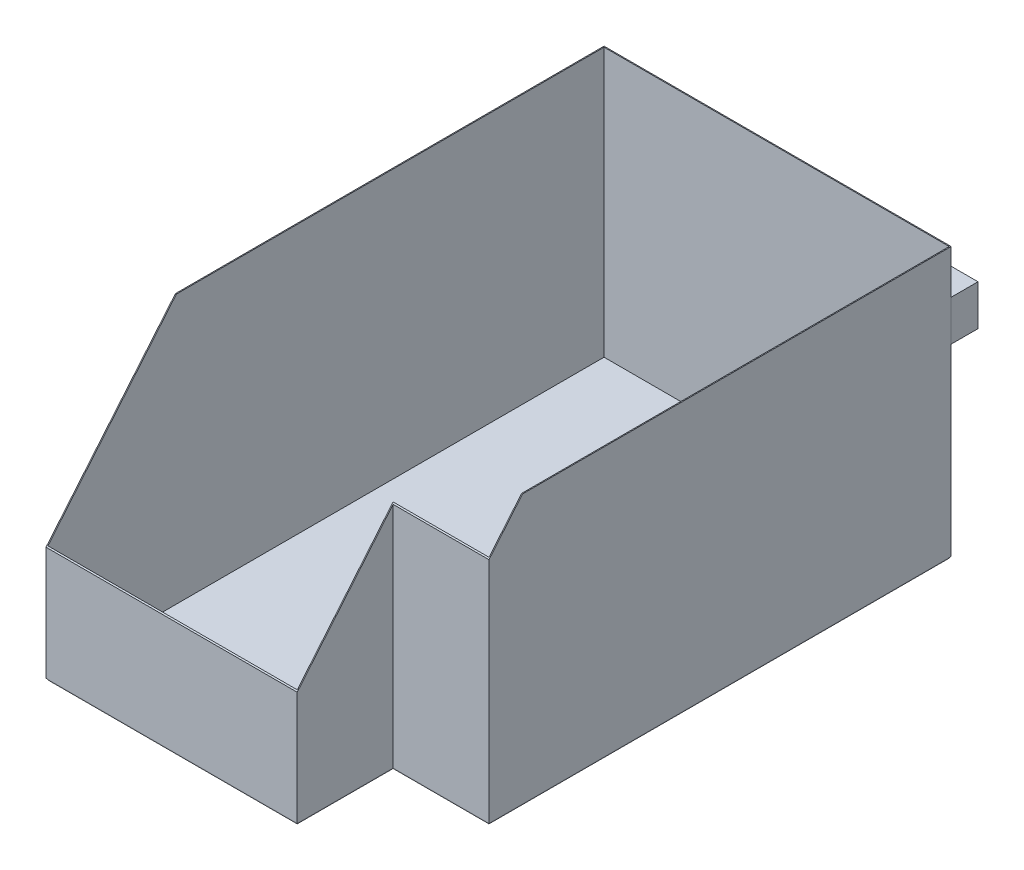
ISO-10303-21;
HEADER;
FILE_DESCRIPTION(('STEP AP214'),'2;1');
FILE_NAME('part.step','',(''),(''),'','','');
FILE_SCHEMA(('AUTOMOTIVE_DESIGN { 1 0 10303 214 1 1 1 1 }'));
ENDSEC;
DATA;
#1=APPLICATION_CONTEXT('core data for automotive mechanical design processes');
#2=APPLICATION_PROTOCOL_DEFINITION('international standard','automotive_design',2000,#1);
#3=PRODUCT_CONTEXT('',#1,'mechanical');
#4=PRODUCT('Part','Part','',(#3));
#5=PRODUCT_RELATED_PRODUCT_CATEGORY('part','',(#4));
#6=PRODUCT_DEFINITION_FORMATION('','',#4);
#7=PRODUCT_DEFINITION_CONTEXT('part definition',#1,'design');
#8=PRODUCT_DEFINITION('design','',#6,#7);
#9=PRODUCT_DEFINITION_SHAPE('','',#8);
#10=(LENGTH_UNIT() NAMED_UNIT(*) SI_UNIT(.MILLI.,.METRE.));
#11=(NAMED_UNIT(*) PLANE_ANGLE_UNIT() SI_UNIT($,.RADIAN.));
#12=(NAMED_UNIT(*) SI_UNIT($,.STERADIAN.) SOLID_ANGLE_UNIT());
#13=UNCERTAINTY_MEASURE_WITH_UNIT(LENGTH_MEASURE(1.E-05),#10,'distance_accuracy_value','');
#14=(GEOMETRIC_REPRESENTATION_CONTEXT(3) GLOBAL_UNCERTAINTY_ASSIGNED_CONTEXT((#13)) GLOBAL_UNIT_ASSIGNED_CONTEXT((#10,
#11,#12)) REPRESENTATION_CONTEXT('',''));
#15=CARTESIAN_POINT('',(0.,0.,0.));
#16=DIRECTION('',(0.,0.,1.));
#17=DIRECTION('',(1.,0.,0.));
#18=AXIS2_PLACEMENT_3D('',#15,#16,#17);
#19=CARTESIAN_POINT('',(277.848616765358,234.676087490139,-247.826300095906));
#20=DIRECTION('',(-1.,0.,0.));
#21=DIRECTION('',(0.,-1.,0.));
#22=AXIS2_PLACEMENT_3D('',#19,#20,#21);
#23=PLANE('',#22);
#24=DIRECTION('',(0.,-1.,0.));
#25=VECTOR('',#24,1.);
#26=CARTESIAN_POINT('',(277.848616765358,234.676087490139,-217.826300095906));
#27=LINE('',#26,#25);
#28=CARTESIAN_POINT('',(277.848616765358,234.676087490139,-217.826300095906));
#29=VERTEX_POINT('',#28);
#30=CARTESIAN_POINT('',(277.848616765358,192.290545925534,-217.826300095906));
#31=VERTEX_POINT('',#30);
#32=EDGE_CURVE('E113',#29,#31,#27,.T.);
#33=ORIENTED_EDGE('',*,*,#32,.T.);
#34=DIRECTION('',(0.,0.,1.));
#35=VECTOR('',#34,1.);
#36=CARTESIAN_POINT('',(277.848616765358,192.290545925534,-247.826300095906));
#37=LINE('',#36,#35);
#38=CARTESIAN_POINT('',(277.848616765358,192.290545925534,-247.826300095906));
#39=VERTEX_POINT('',#38);
#40=EDGE_CURVE('E12',#39,#31,#37,.T.);
#41=ORIENTED_EDGE('',*,*,#40,.F.);
#42=DIRECTION('',(0.,-1.,0.));
#43=VECTOR('',#42,1.);
#44=CARTESIAN_POINT('',(277.848616765358,234.676087490139,-247.826300095906));
#45=LINE('',#44,#43);
#46=CARTESIAN_POINT('',(277.848616765358,234.676087490139,-247.826300095906));
#47=VERTEX_POINT('',#46);
#48=EDGE_CURVE('E101',#47,#39,#45,.T.);
#49=ORIENTED_EDGE('',*,*,#48,.F.);
#50=DIRECTION('',(0.,0.,1.));
#51=VECTOR('',#50,1.);
#52=CARTESIAN_POINT('',(277.848616765358,234.676087490139,-247.826300095906));
#53=LINE('',#52,#51);
#54=EDGE_CURVE('E109',#47,#29,#53,.T.);
#55=ORIENTED_EDGE('',*,*,#54,.T.);
#56=EDGE_LOOP('',(#33,#41,#49,#55));
#57=FACE_BOUND('',#56,.T.);
#58=ADVANCED_FACE('F50',(#57),#23,.F.);
#59=CARTESIAN_POINT('',(277.848616765358,192.290545925534,-247.826300095906));
#60=DIRECTION('',(0.,1.,0.));
#61=DIRECTION('',(0.,0.,1.));
#62=AXIS2_PLACEMENT_3D('',#59,#60,#61);
#63=PLANE('',#62);
#64=DIRECTION('',(-1.,0.,0.));
#65=VECTOR('',#64,1.);
#66=CARTESIAN_POINT('',(277.848616765358,192.290545925534,-217.826300095906));
#67=LINE('',#66,#65);
#68=CARTESIAN_POINT('',(-82.1513832346425,192.290545925534,-217.826300095906));
#69=VERTEX_POINT('',#68);
#70=EDGE_CURVE('E105',#31,#69,#67,.T.);
#71=ORIENTED_EDGE('',*,*,#70,.T.);
#72=DIRECTION('',(0.,0.,1.));
#73=VECTOR('',#72,1.);
#74=CARTESIAN_POINT('',(-82.1513832346425,192.290545925534,-247.826300095906));
#75=LINE('',#74,#73);
#76=CARTESIAN_POINT('',(-82.1513832346425,192.290545925534,-247.826300095906));
#77=VERTEX_POINT('',#76);
#78=EDGE_CURVE('E58',#77,#69,#75,.T.);
#79=ORIENTED_EDGE('',*,*,#78,.F.);
#80=DIRECTION('',(-1.,0.,0.));
#81=VECTOR('',#80,1.);
#82=CARTESIAN_POINT('',(277.848616765358,192.290545925534,-247.826300095906));
#83=LINE('',#82,#81);
#84=EDGE_CURVE('E96',#39,#77,#83,.T.);
#85=ORIENTED_EDGE('',*,*,#84,.F.);
#86=ORIENTED_EDGE('',*,*,#40,.T.);
#87=EDGE_LOOP('',(#71,#79,#85,#86));
#88=FACE_BOUND('',#87,.T.);
#89=ADVANCED_FACE('F104',(#88),#63,.F.);
#90=CARTESIAN_POINT('',(-82.1513832346424,234.676087490139,-247.826300095906));
#91=DIRECTION('',(1.,0.,0.));
#92=DIRECTION('',(0.,1.,0.));
#93=AXIS2_PLACEMENT_3D('',#90,#91,#92);
#94=PLANE('',#93);
#95=DIRECTION('',(0.,1.,0.));
#96=VECTOR('',#95,1.);
#97=CARTESIAN_POINT('',(-82.1513832346424,234.676087490139,-217.826300095906));
#98=LINE('',#97,#96);
#99=CARTESIAN_POINT('',(-82.1513832346424,234.676087490139,-217.826300095906));
#100=VERTEX_POINT('',#99);
#101=EDGE_CURVE('E83',#69,#100,#98,.T.);
#102=ORIENTED_EDGE('',*,*,#101,.T.);
#103=DIRECTION('',(0.,0.,1.));
#104=VECTOR('',#103,1.);
#105=CARTESIAN_POINT('',(-82.1513832346424,234.676087490139,-247.826300095906));
#106=LINE('',#105,#104);
#107=CARTESIAN_POINT('',(-82.1513832346424,234.676087490139,-247.826300095906));
#108=VERTEX_POINT('',#107);
#109=EDGE_CURVE('E106',#108,#100,#106,.T.);
#110=ORIENTED_EDGE('',*,*,#109,.F.);
#111=DIRECTION('',(0.,1.,0.));
#112=VECTOR('',#111,1.);
#113=CARTESIAN_POINT('',(-82.1513832346424,234.676087490139,-247.826300095906));
#114=LINE('',#113,#112);
#115=EDGE_CURVE('E99',#77,#108,#114,.T.);
#116=ORIENTED_EDGE('',*,*,#115,.F.);
#117=ORIENTED_EDGE('',*,*,#78,.T.);
#118=EDGE_LOOP('',(#102,#110,#116,#117));
#119=FACE_BOUND('',#118,.T.);
#120=ADVANCED_FACE('F107',(#119),#94,.F.);
#121=CARTESIAN_POINT('',(277.848616765358,234.676087490139,-247.826300095906));
#122=DIRECTION('',(0.,-1.,0.));
#123=DIRECTION('',(0.,0.,-1.));
#124=AXIS2_PLACEMENT_3D('',#121,#122,#123);
#125=PLANE('',#124);
#126=DIRECTION('',(1.,0.,0.));
#127=VECTOR('',#126,1.);
#128=CARTESIAN_POINT('',(277.848616765358,234.676087490139,-217.826300095906));
#129=LINE('',#128,#127);
#130=EDGE_CURVE('E89',#100,#29,#129,.T.);
#131=ORIENTED_EDGE('',*,*,#130,.T.);
#132=ORIENTED_EDGE('',*,*,#54,.F.);
#133=DIRECTION('',(1.,0.,0.));
#134=VECTOR('',#133,1.);
#135=CARTESIAN_POINT('',(277.848616765358,234.676087490139,-247.826300095906));
#136=LINE('',#135,#134);
#137=EDGE_CURVE('E66',#108,#47,#136,.T.);
#138=ORIENTED_EDGE('',*,*,#137,.F.);
#139=ORIENTED_EDGE('',*,*,#109,.T.);
#140=EDGE_LOOP('',(#131,#132,#138,#139));
#141=FACE_BOUND('',#140,.T.);
#142=ADVANCED_FACE('F120',(#141),#125,.F.);
#143=CARTESIAN_POINT('',(0.,0.,-247.826300095906));
#144=DIRECTION('',(0.,0.,-1.));
#145=DIRECTION('',(-1.,0.,0.));
#146=AXIS2_PLACEMENT_3D('',#143,#144,#145);
#147=PLANE('',#146);
#148=ORIENTED_EDGE('',*,*,#48,.T.);
#149=ORIENTED_EDGE('',*,*,#84,.T.);
#150=ORIENTED_EDGE('',*,*,#115,.T.);
#151=ORIENTED_EDGE('',*,*,#137,.T.);
#152=EDGE_LOOP('',(#148,#149,#150,#151));
#153=FACE_BOUND('',#152,.T.);
#154=ADVANCED_FACE('F97',(#153),#147,.T.);
#155=CARTESIAN_POINT('',(0.,0.,-217.826300095906));
#156=DIRECTION('',(0.,0.,-1.));
#157=DIRECTION('',(-1.,0.,0.));
#158=AXIS2_PLACEMENT_3D('',#155,#156,#157);
#159=PLANE('',#158);
#160=ORIENTED_EDGE('',*,*,#32,.F.);
#161=ORIENTED_EDGE('',*,*,#130,.F.);
#162=ORIENTED_EDGE('',*,*,#101,.F.);
#163=ORIENTED_EDGE('',*,*,#70,.F.);
#164=EDGE_LOOP('',(#160,#161,#162,#163));
#165=FACE_BOUND('',#164,.T.);
#166=ADVANCED_FACE('F123',(#165),#159,.F.);
#167=CLOSED_SHELL('',(#58,#89,#120,#142,#154,#166));
#168=MANIFOLD_SOLID_BREP('B2',#167);
#169=CARTESIAN_POINT('',(0.,281.5,0.));
#170=DIRECTION('',(0.,1.,0.));
#171=DIRECTION('',(0.,0.,1.));
#172=AXIS2_PLACEMENT_3D('',#169,#170,#171);
#173=PLANE('',#172);
#174=DIRECTION('',(-1.,0.,0.));
#175=VECTOR('',#174,1.);
#176=CARTESIAN_POINT('',(278.848616765358,281.5,228.19522270556));
#177=LINE('',#176,#175);
#178=CARTESIAN_POINT('',(278.848616765358,281.5,228.19522270556));
#179=VERTEX_POINT('',#178);
#180=CARTESIAN_POINT('',(277.848616765358,281.5,228.19522270556));
#181=VERTEX_POINT('',#180);
#182=EDGE_CURVE('E198',#179,#181,#177,.T.);
#183=ORIENTED_EDGE('',*,*,#182,.F.);
#184=DIRECTION('',(0.,0.,-1.));
#185=VECTOR('',#184,1.);
#186=CARTESIAN_POINT('',(278.848616765358,281.5,263.173699904094));
#187=LINE('',#186,#185);
#188=CARTESIAN_POINT('',(278.848616765358,281.5,-218.826300095906));
#189=VERTEX_POINT('',#188);
#190=EDGE_CURVE('E310',#179,#189,#187,.T.);
#191=ORIENTED_EDGE('',*,*,#190,.T.);
#192=DIRECTION('',(-1.,0.,0.));
#193=VECTOR('',#192,1.);
#194=CARTESIAN_POINT('',(278.848616765358,281.5,-218.826300095906));
#195=LINE('',#194,#193);
#196=CARTESIAN_POINT('',(-83.1513832346424,281.5,-218.826300095906));
#197=VERTEX_POINT('',#196);
#198=EDGE_CURVE('E307',#189,#197,#195,.T.);
#199=ORIENTED_EDGE('',*,*,#198,.T.);
#200=DIRECTION('',(0.,0.,1.));
#201=VECTOR('',#200,1.);
#202=CARTESIAN_POINT('',(-83.1513832346424,281.5,-218.826300095906));
#203=LINE('',#202,#201);
#204=CARTESIAN_POINT('',(-83.1513832346425,281.5,228.19522270556));
#205=VERTEX_POINT('',#204);
#206=EDGE_CURVE('E302',#197,#205,#203,.T.);
#207=ORIENTED_EDGE('',*,*,#206,.T.);
#208=CARTESIAN_POINT('',(-82.1513832346424,281.5,228.19522270556));
#209=VERTEX_POINT('',#208);
#210=EDGE_CURVE('E284',#209,#205,#177,.T.);
#211=ORIENTED_EDGE('',*,*,#210,.F.);
#212=DIRECTION('',(0.,0.,1.));
#213=VECTOR('',#212,1.);
#214=CARTESIAN_POINT('',(-82.1513832346424,281.5,-217.826300095906));
#215=LINE('',#214,#213);
#216=CARTESIAN_POINT('',(-82.1513832346424,281.5,-217.826300095906));
#217=VERTEX_POINT('',#216);
#218=EDGE_CURVE('E399',#217,#209,#215,.T.);
#219=ORIENTED_EDGE('',*,*,#218,.F.);
#220=DIRECTION('',(-1.,0.,0.));
#221=VECTOR('',#220,1.);
#222=CARTESIAN_POINT('',(277.848616765358,281.5,-217.826300095906));
#223=LINE('',#222,#221);
#224=CARTESIAN_POINT('',(277.848616765358,281.5,-217.826300095906));
#225=VERTEX_POINT('',#224);
#226=EDGE_CURVE('E396',#225,#217,#223,.T.);
#227=ORIENTED_EDGE('',*,*,#226,.F.);
#228=DIRECTION('',(0.,0.,-1.));
#229=VECTOR('',#228,1.);
#230=CARTESIAN_POINT('',(277.848616765358,281.5,262.173699904094));
#231=LINE('',#230,#229);
#232=EDGE_CURVE('E403',#181,#225,#231,.T.);
#233=ORIENTED_EDGE('',*,*,#232,.F.);
#234=EDGE_LOOP('',(#183,#191,#199,#207,#211,#219,#227,#233));
#235=FACE_BOUND('',#234,.T.);
#236=ADVANCED_FACE('F183',(#235),#173,.T.);
#237=CARTESIAN_POINT('',(0.,1.5,0.));
#238=DIRECTION('',(0.,1.,0.));
#239=DIRECTION('',(0.,0.,1.));
#240=AXIS2_PLACEMENT_3D('',#237,#238,#239);
#241=PLANE('',#240);
#242=DIRECTION('',(0.,0.,1.));
#243=VECTOR('',#242,1.);
#244=CARTESIAN_POINT('',(-83.1513832346424,1.5,-218.826300095906));
#245=LINE('',#244,#243);
#246=CARTESIAN_POINT('',(-83.1513832346424,1.5,-218.826300095906));
#247=VERTEX_POINT('',#246);
#248=CARTESIAN_POINT('',(-83.1513832346424,1.5,363.173699904094));
#249=VERTEX_POINT('',#248);
#250=EDGE_CURVE('E325',#247,#249,#245,.T.);
#251=ORIENTED_EDGE('',*,*,#250,.F.);
#252=DIRECTION('',(-1.,0.,0.));
#253=VECTOR('',#252,1.);
#254=CARTESIAN_POINT('',(278.848616765358,1.5,-218.826300095906));
#255=LINE('',#254,#253);
#256=CARTESIAN_POINT('',(278.848616765358,1.5,-218.826300095906));
#257=VERTEX_POINT('',#256);
#258=EDGE_CURVE('E311',#257,#247,#255,.T.);
#259=ORIENTED_EDGE('',*,*,#258,.F.);
#260=DIRECTION('',(0.,0.,-1.));
#261=VECTOR('',#260,1.);
#262=CARTESIAN_POINT('',(278.848616765358,1.5,263.173699904094));
#263=LINE('',#262,#261);
#264=CARTESIAN_POINT('',(278.848616765358,1.5,263.173699904094));
#265=VERTEX_POINT('',#264);
#266=EDGE_CURVE('E316',#265,#257,#263,.T.);
#267=ORIENTED_EDGE('',*,*,#266,.F.);
#268=DIRECTION('',(1.,0.,0.));
#269=VECTOR('',#268,1.);
#270=CARTESIAN_POINT('',(178.848616765358,1.5,263.173699904094));
#271=LINE('',#270,#269);
#272=CARTESIAN_POINT('',(178.848616765358,1.5,263.173699904094));
#273=VERTEX_POINT('',#272);
#274=EDGE_CURVE('E336',#273,#265,#271,.T.);
#275=ORIENTED_EDGE('',*,*,#274,.F.);
#276=DIRECTION('',(0.,0.,-1.));
#277=VECTOR('',#276,1.);
#278=CARTESIAN_POINT('',(178.848616765358,1.5,363.173699904094));
#279=LINE('',#278,#277);
#280=CARTESIAN_POINT('',(178.848616765358,1.5,363.173699904094));
#281=VERTEX_POINT('',#280);
#282=EDGE_CURVE('E332',#281,#273,#279,.T.);
#283=ORIENTED_EDGE('',*,*,#282,.F.);
#284=DIRECTION('',(1.,0.,0.));
#285=VECTOR('',#284,1.);
#286=CARTESIAN_POINT('',(-83.1513832346424,1.5,363.173699904094));
#287=LINE('',#286,#285);
#288=EDGE_CURVE('E328',#249,#281,#287,.T.);
#289=ORIENTED_EDGE('',*,*,#288,.F.);
#290=EDGE_LOOP('',(#251,#259,#267,#275,#283,#289));
#291=FACE_BOUND('',#290,.T.);
#292=DIRECTION('',(-1.,0.,0.));
#293=VECTOR('',#292,1.);
#294=CARTESIAN_POINT('',(277.848616765358,1.5,-217.826300095906));
#295=LINE('',#294,#293);
#296=CARTESIAN_POINT('',(277.848616765358,1.5,-217.826300095906));
#297=VERTEX_POINT('',#296);
#298=CARTESIAN_POINT('',(-82.1513832346424,1.5,-217.826300095906));
#299=VERTEX_POINT('',#298);
#300=EDGE_CURVE('E206',#297,#299,#295,.T.);
#301=ORIENTED_EDGE('',*,*,#300,.T.);
#302=DIRECTION('',(0.,0.,1.));
#303=VECTOR('',#302,1.);
#304=CARTESIAN_POINT('',(-82.1513832346424,1.5,-217.826300095906));
#305=LINE('',#304,#303);
#306=CARTESIAN_POINT('',(-82.1513832346424,1.5,362.173699904094));
#307=VERTEX_POINT('',#306);
#308=EDGE_CURVE('E391',#299,#307,#305,.T.);
#309=ORIENTED_EDGE('',*,*,#308,.T.);
#310=DIRECTION('',(1.,0.,0.));
#311=VECTOR('',#310,1.);
#312=CARTESIAN_POINT('',(-82.1513832346424,1.5,362.173699904094));
#313=LINE('',#312,#311);
#314=CARTESIAN_POINT('',(177.848616765358,1.5,362.173699904094));
#315=VERTEX_POINT('',#314);
#316=EDGE_CURVE('E410',#307,#315,#313,.T.);
#317=ORIENTED_EDGE('',*,*,#316,.T.);
#318=DIRECTION('',(0.,0.,-1.));
#319=VECTOR('',#318,1.);
#320=CARTESIAN_POINT('',(177.848616765358,1.5,362.173699904094));
#321=LINE('',#320,#319);
#322=CARTESIAN_POINT('',(177.848616765358,1.5,262.173699904094));
#323=VERTEX_POINT('',#322);
#324=EDGE_CURVE('E414',#315,#323,#321,.T.);
#325=ORIENTED_EDGE('',*,*,#324,.T.);
#326=DIRECTION('',(1.,0.,0.));
#327=VECTOR('',#326,1.);
#328=CARTESIAN_POINT('',(177.848616765358,1.5,262.173699904094));
#329=LINE('',#328,#327);
#330=CARTESIAN_POINT('',(277.848616765358,1.5,262.173699904094));
#331=VERTEX_POINT('',#330);
#332=EDGE_CURVE('E418',#323,#331,#329,.T.);
#333=ORIENTED_EDGE('',*,*,#332,.T.);
#334=DIRECTION('',(0.,0.,-1.));
#335=VECTOR('',#334,1.);
#336=CARTESIAN_POINT('',(277.848616765358,1.5,262.173699904094));
#337=LINE('',#336,#335);
#338=EDGE_CURVE('E400',#331,#297,#337,.T.);
#339=ORIENTED_EDGE('',*,*,#338,.T.);
#340=EDGE_LOOP('',(#301,#309,#317,#325,#333,#339));
#341=FACE_BOUND('',#340,.T.);
#342=ADVANCED_FACE('F365',(#291,#341),#241,.F.);
#343=CARTESIAN_POINT('',(-83.1513832346424,281.5,-218.826300095906));
#344=DIRECTION('',(1.,0.,0.));
#345=DIRECTION('',(0.,0.,-1.));
#346=AXIS2_PLACEMENT_3D('',#343,#344,#345);
#347=PLANE('',#346);
#348=DIRECTION('',(0.,-1.,0.));
#349=VECTOR('',#348,1.);
#350=CARTESIAN_POINT('',(-83.1513832346424,281.5,363.173699904094));
#351=LINE('',#350,#349);
#352=CARTESIAN_POINT('',(-83.1513832346425,119.920481981417,363.173699904094));
#353=VERTEX_POINT('',#352);
#354=EDGE_CURVE('E192',#353,#249,#351,.T.);
#355=ORIENTED_EDGE('',*,*,#354,.F.);
#356=DIRECTION('',(0.,-0.76745249417068,0.641105817467914));
#357=VECTOR('',#356,1.);
#358=CARTESIAN_POINT('',(-83.1513832346425,119.920481981417,363.173699904094));
#359=LINE('',#358,#357);
#360=EDGE_CURVE('E287',#205,#353,#359,.T.);
#361=ORIENTED_EDGE('',*,*,#360,.F.);
#362=ORIENTED_EDGE('',*,*,#206,.F.);
#363=DIRECTION('',(0.,-1.,0.));
#364=VECTOR('',#363,1.);
#365=CARTESIAN_POINT('',(-83.1513832346424,281.5,-218.826300095906));
#366=LINE('',#365,#364);
#367=EDGE_CURVE('E324',#197,#247,#366,.T.);
#368=ORIENTED_EDGE('',*,*,#367,.T.);
#369=ORIENTED_EDGE('',*,*,#250,.T.);
#370=EDGE_LOOP('',(#355,#361,#362,#368,#369));
#371=FACE_BOUND('',#370,.T.);
#372=ADVANCED_FACE('F185',(#371),#347,.F.);
#373=CARTESIAN_POINT('',(-83.1513832346424,281.5,363.173699904094));
#374=DIRECTION('',(0.,0.,-1.));
#375=DIRECTION('',(-1.,0.,0.));
#376=AXIS2_PLACEMENT_3D('',#373,#374,#375);
#377=PLANE('',#376);
#378=DIRECTION('',(0.,-1.,0.));
#379=VECTOR('',#378,1.);
#380=CARTESIAN_POINT('',(178.848616765358,281.5,363.173699904094));
#381=LINE('',#380,#379);
#382=CARTESIAN_POINT('',(178.848616765358,119.920481981417,363.173699904094));
#383=VERTEX_POINT('',#382);
#384=EDGE_CURVE('E354',#383,#281,#381,.T.);
#385=ORIENTED_EDGE('',*,*,#384,.F.);
#386=DIRECTION('',(-1.,0.,0.));
#387=VECTOR('',#386,1.);
#388=CARTESIAN_POINT('',(278.848616765358,119.920481981417,363.173699904094));
#389=LINE('',#388,#387);
#390=EDGE_CURVE('E362',#383,#353,#389,.T.);
#391=ORIENTED_EDGE('',*,*,#390,.T.);
#392=ORIENTED_EDGE('',*,*,#354,.T.);
#393=ORIENTED_EDGE('',*,*,#288,.T.);
#394=EDGE_LOOP('',(#385,#391,#392,#393));
#395=FACE_BOUND('',#394,.T.);
#396=ADVANCED_FACE('F360',(#395),#377,.F.);
#397=CARTESIAN_POINT('',(178.848616765358,281.5,363.173699904094));
#398=DIRECTION('',(-1.,0.,0.));
#399=DIRECTION('',(0.,0.,1.));
#400=AXIS2_PLACEMENT_3D('',#397,#398,#399);
#401=PLANE('',#400);
#402=DIRECTION('',(0.,-1.,0.));
#403=VECTOR('',#402,1.);
#404=CARTESIAN_POINT('',(178.848616765358,281.5,263.173699904094));
#405=LINE('',#404,#403);
#406=CARTESIAN_POINT('',(178.848616765358,239.628098611973,263.173699904094));
#407=VERTEX_POINT('',#406);
#408=EDGE_CURVE('E351',#407,#273,#405,.T.);
#409=ORIENTED_EDGE('',*,*,#408,.F.);
#410=DIRECTION('',(0.,-0.76745249417068,0.641105817467914));
#411=VECTOR('',#410,1.);
#412=CARTESIAN_POINT('',(178.848616765358,215.088124694482,283.673626816202));
#413=LINE('',#412,#411);
#414=EDGE_CURVE('E386',#407,#383,#413,.T.);
#415=ORIENTED_EDGE('',*,*,#414,.T.);
#416=ORIENTED_EDGE('',*,*,#384,.T.);
#417=ORIENTED_EDGE('',*,*,#282,.T.);
#418=EDGE_LOOP('',(#409,#415,#416,#417));
#419=FACE_BOUND('',#418,.T.);
#420=ADVANCED_FACE('F385',(#419),#401,.F.);
#421=CARTESIAN_POINT('',(178.848616765358,281.5,263.173699904094));
#422=DIRECTION('',(0.,0.,-1.));
#423=DIRECTION('',(-1.,0.,0.));
#424=AXIS2_PLACEMENT_3D('',#421,#422,#423);
#425=PLANE('',#424);
#426=DIRECTION('',(0.,-1.,0.));
#427=VECTOR('',#426,1.);
#428=CARTESIAN_POINT('',(278.848616765358,281.5,263.173699904094));
#429=LINE('',#428,#427);
#430=CARTESIAN_POINT('',(278.848616765358,239.628098611973,263.173699904094));
#431=VERTEX_POINT('',#430);
#432=EDGE_CURVE('E348',#431,#265,#429,.T.);
#433=ORIENTED_EDGE('',*,*,#432,.F.);
#434=DIRECTION('',(-1.,0.,0.));
#435=VECTOR('',#434,1.);
#436=CARTESIAN_POINT('',(178.848616765358,239.628098611973,263.173699904094));
#437=LINE('',#436,#435);
#438=EDGE_CURVE('E382',#431,#407,#437,.T.);
#439=ORIENTED_EDGE('',*,*,#438,.T.);
#440=ORIENTED_EDGE('',*,*,#408,.T.);
#441=ORIENTED_EDGE('',*,*,#274,.T.);
#442=EDGE_LOOP('',(#433,#439,#440,#441));
#443=FACE_BOUND('',#442,.T.);
#444=ADVANCED_FACE('F380',(#443),#425,.F.);
#445=CARTESIAN_POINT('',(278.848616765358,281.5,263.173699904094));
#446=DIRECTION('',(-1.,0.,0.));
#447=DIRECTION('',(0.,0.,1.));
#448=AXIS2_PLACEMENT_3D('',#445,#446,#447);
#449=PLANE('',#448);
#450=ORIENTED_EDGE('',*,*,#190,.F.);
#451=DIRECTION('',(0.,-0.76745249417068,0.641105817467914));
#452=VECTOR('',#451,1.);
#453=CARTESIAN_POINT('',(278.848616765358,119.920481981417,363.173699904094));
#454=LINE('',#453,#452);
#455=EDGE_CURVE('E296',#179,#431,#454,.T.);
#456=ORIENTED_EDGE('',*,*,#455,.T.);
#457=ORIENTED_EDGE('',*,*,#432,.T.);
#458=ORIENTED_EDGE('',*,*,#266,.T.);
#459=DIRECTION('',(0.,-1.,0.));
#460=VECTOR('',#459,1.);
#461=CARTESIAN_POINT('',(278.848616765358,281.5,-218.826300095906));
#462=LINE('',#461,#460);
#463=EDGE_CURVE('E344',#189,#257,#462,.T.);
#464=ORIENTED_EDGE('',*,*,#463,.F.);
#465=EDGE_LOOP('',(#450,#456,#457,#458,#464));
#466=FACE_BOUND('',#465,.T.);
#467=ADVANCED_FACE('F375',(#466),#449,.F.);
#468=CARTESIAN_POINT('',(278.848616765358,281.5,-218.826300095906));
#469=DIRECTION('',(0.,0.,1.));
#470=DIRECTION('',(1.,0.,0.));
#471=AXIS2_PLACEMENT_3D('',#468,#469,#470);
#472=PLANE('',#471);
#473=ORIENTED_EDGE('',*,*,#258,.T.);
#474=ORIENTED_EDGE('',*,*,#367,.F.);
#475=ORIENTED_EDGE('',*,*,#198,.F.);
#476=ORIENTED_EDGE('',*,*,#463,.T.);
#477=EDGE_LOOP('',(#473,#474,#475,#476));
#478=FACE_BOUND('',#477,.T.);
#479=ADVANCED_FACE('F370',(#478),#472,.F.);
#480=CARTESIAN_POINT('',(277.848616765358,281.5,-217.826300095906));
#481=DIRECTION('',(0.,0.,1.));
#482=DIRECTION('',(1.,0.,0.));
#483=AXIS2_PLACEMENT_3D('',#480,#481,#482);
#484=PLANE('',#483);
#485=ORIENTED_EDGE('',*,*,#300,.F.);
#486=DIRECTION('',(0.,-1.,0.));
#487=VECTOR('',#486,1.);
#488=CARTESIAN_POINT('',(277.848616765358,281.5,-217.826300095906));
#489=LINE('',#488,#487);
#490=EDGE_CURVE('E405',#225,#297,#489,.T.);
#491=ORIENTED_EDGE('',*,*,#490,.F.);
#492=ORIENTED_EDGE('',*,*,#226,.T.);
#493=DIRECTION('',(0.,-1.,0.));
#494=VECTOR('',#493,1.);
#495=CARTESIAN_POINT('',(-82.1513832346424,281.5,-217.826300095906));
#496=LINE('',#495,#494);
#497=EDGE_CURVE('E319',#217,#299,#496,.T.);
#498=ORIENTED_EDGE('',*,*,#497,.T.);
#499=EDGE_LOOP('',(#485,#491,#492,#498));
#500=FACE_BOUND('',#499,.T.);
#501=ADVANCED_FACE('F442',(#500),#484,.T.);
#502=CARTESIAN_POINT('',(-82.1513832346424,281.5,-217.826300095906));
#503=DIRECTION('',(1.,0.,0.));
#504=DIRECTION('',(0.,0.,-1.));
#505=AXIS2_PLACEMENT_3D('',#502,#503,#504);
#506=PLANE('',#505);
#507=DIRECTION('',(0.,0.76745249417068,-0.641105817467914));
#508=VECTOR('',#507,1.);
#509=CARTESIAN_POINT('',(-82.1513832346424,500.950732966114,44.8729420161136));
#510=LINE('',#509,#508);
#511=CARTESIAN_POINT('',(-82.1513832346424,121.117558147723,362.173699904094));
#512=VERTEX_POINT('',#511);
#513=EDGE_CURVE('E290',#512,#209,#510,.T.);
#514=ORIENTED_EDGE('',*,*,#513,.F.);
#515=DIRECTION('',(0.,-1.,0.));
#516=VECTOR('',#515,1.);
#517=CARTESIAN_POINT('',(-82.1513832346424,281.5,362.173699904094));
#518=LINE('',#517,#516);
#519=EDGE_CURVE('E435',#512,#307,#518,.T.);
#520=ORIENTED_EDGE('',*,*,#519,.T.);
#521=ORIENTED_EDGE('',*,*,#308,.F.);
#522=ORIENTED_EDGE('',*,*,#497,.F.);
#523=ORIENTED_EDGE('',*,*,#218,.T.);
#524=EDGE_LOOP('',(#514,#520,#521,#522,#523));
#525=FACE_BOUND('',#524,.T.);
#526=ADVANCED_FACE('F450',(#525),#506,.T.);
#527=CARTESIAN_POINT('',(-82.1513832346424,281.5,362.173699904094));
#528=DIRECTION('',(0.,0.,-1.));
#529=DIRECTION('',(-1.,0.,0.));
#530=AXIS2_PLACEMENT_3D('',#527,#528,#529);
#531=PLANE('',#530);
#532=DIRECTION('',(-1.,0.,0.));
#533=VECTOR('',#532,1.);
#534=CARTESIAN_POINT('',(-82.1513832346426,121.117558147723,362.173699904094));
#535=LINE('',#534,#533);
#536=CARTESIAN_POINT('',(177.848616765358,121.117558147723,362.173699904094));
#537=VERTEX_POINT('',#536);
#538=EDGE_CURVE('E452',#537,#512,#535,.T.);
#539=ORIENTED_EDGE('',*,*,#538,.F.);
#540=DIRECTION('',(0.,-1.,0.));
#541=VECTOR('',#540,1.);
#542=CARTESIAN_POINT('',(177.848616765358,281.5,362.173699904094));
#543=LINE('',#542,#541);
#544=EDGE_CURVE('E433',#537,#315,#543,.T.);
#545=ORIENTED_EDGE('',*,*,#544,.T.);
#546=ORIENTED_EDGE('',*,*,#316,.F.);
#547=ORIENTED_EDGE('',*,*,#519,.F.);
#548=EDGE_LOOP('',(#539,#545,#546,#547));
#549=FACE_BOUND('',#548,.T.);
#550=ADVANCED_FACE('F455',(#549),#531,.T.);
#551=CARTESIAN_POINT('',(177.848616765358,281.5,362.173699904094));
#552=DIRECTION('',(-1.,0.,0.));
#553=DIRECTION('',(0.,0.,1.));
#554=AXIS2_PLACEMENT_3D('',#551,#552,#553);
#555=PLANE('',#554);
#556=DIRECTION('',(0.,-0.76745249417068,0.641105817467914));
#557=VECTOR('',#556,1.);
#558=CARTESIAN_POINT('',(177.848616765358,215.580142953125,283.262610147011));
#559=LINE('',#558,#557);
#560=CARTESIAN_POINT('',(177.848616765358,240.825174778278,262.173699904094));
#561=VERTEX_POINT('',#560);
#562=EDGE_CURVE('E462',#561,#537,#559,.T.);
#563=ORIENTED_EDGE('',*,*,#562,.F.);
#564=DIRECTION('',(0.,-1.,0.));
#565=VECTOR('',#564,1.);
#566=CARTESIAN_POINT('',(177.848616765358,281.5,262.173699904094));
#567=LINE('',#566,#565);
#568=EDGE_CURVE('E430',#561,#323,#567,.T.);
#569=ORIENTED_EDGE('',*,*,#568,.T.);
#570=ORIENTED_EDGE('',*,*,#324,.F.);
#571=ORIENTED_EDGE('',*,*,#544,.F.);
#572=EDGE_LOOP('',(#563,#569,#570,#571));
#573=FACE_BOUND('',#572,.T.);
#574=ADVANCED_FACE('F460',(#573),#555,.T.);
#575=CARTESIAN_POINT('',(177.848616765358,281.5,262.173699904094));
#576=DIRECTION('',(0.,0.,-1.));
#577=DIRECTION('',(-1.,0.,0.));
#578=AXIS2_PLACEMENT_3D('',#575,#576,#577);
#579=PLANE('',#578);
#580=DIRECTION('',(-1.,0.,0.));
#581=VECTOR('',#580,1.);
#582=CARTESIAN_POINT('',(177.848616765358,240.825174778278,262.173699904094));
#583=LINE('',#582,#581);
#584=CARTESIAN_POINT('',(277.848616765358,240.825174778279,262.173699904094));
#585=VERTEX_POINT('',#584);
#586=EDGE_CURVE('E466',#585,#561,#583,.T.);
#587=ORIENTED_EDGE('',*,*,#586,.F.);
#588=DIRECTION('',(0.,-1.,0.));
#589=VECTOR('',#588,1.);
#590=CARTESIAN_POINT('',(277.848616765358,281.5,262.173699904094));
#591=LINE('',#590,#589);
#592=EDGE_CURVE('E427',#585,#331,#591,.T.);
#593=ORIENTED_EDGE('',*,*,#592,.T.);
#594=ORIENTED_EDGE('',*,*,#332,.F.);
#595=ORIENTED_EDGE('',*,*,#568,.F.);
#596=EDGE_LOOP('',(#587,#593,#594,#595));
#597=FACE_BOUND('',#596,.T.);
#598=ADVANCED_FACE('F465',(#597),#579,.T.);
#599=CARTESIAN_POINT('',(277.848616765358,281.5,262.173699904094));
#600=DIRECTION('',(-1.,0.,0.));
#601=DIRECTION('',(0.,0.,1.));
#602=AXIS2_PLACEMENT_3D('',#599,#600,#601);
#603=PLANE('',#602);
#604=DIRECTION('',(0.,-0.76745249417068,0.641105817467914));
#605=VECTOR('',#604,1.);
#606=CARTESIAN_POINT('',(277.848616765358,264.781968817434,242.16094322789));
#607=LINE('',#606,#605);
#608=EDGE_CURVE('E48',#181,#585,#607,.T.);
#609=ORIENTED_EDGE('',*,*,#608,.F.);
#610=ORIENTED_EDGE('',*,*,#232,.T.);
#611=ORIENTED_EDGE('',*,*,#490,.T.);
#612=ORIENTED_EDGE('',*,*,#338,.F.);
#613=ORIENTED_EDGE('',*,*,#592,.F.);
#614=EDGE_LOOP('',(#609,#610,#611,#612,#613));
#615=FACE_BOUND('',#614,.T.);
#616=ADVANCED_FACE('F448',(#615),#603,.T.);
#617=CARTESIAN_POINT('',(278.848616765358,119.920481981417,363.173699904094));
#618=DIRECTION('',(0.,-0.641105817467914,-0.76745249417068));
#619=DIRECTION('',(0.,0.76745249417068,-0.641105817467914));
#620=AXIS2_PLACEMENT_3D('',#617,#618,#619);
#621=PLANE('',#620);
#622=ORIENTED_EDGE('',*,*,#438,.F.);
#623=ORIENTED_EDGE('',*,*,#455,.F.);
#624=ORIENTED_EDGE('',*,*,#182,.T.);
#625=ORIENTED_EDGE('',*,*,#608,.T.);
#626=ORIENTED_EDGE('',*,*,#586,.T.);
#627=ORIENTED_EDGE('',*,*,#562,.T.);
#628=ORIENTED_EDGE('',*,*,#538,.T.);
#629=ORIENTED_EDGE('',*,*,#513,.T.);
#630=ORIENTED_EDGE('',*,*,#210,.T.);
#631=ORIENTED_EDGE('',*,*,#360,.T.);
#632=ORIENTED_EDGE('',*,*,#390,.F.);
#633=ORIENTED_EDGE('',*,*,#414,.F.);
#634=EDGE_LOOP('',(#622,#623,#624,#625,#626,#627,#628,#629,#630,#631,#632,#633));
#635=FACE_BOUND('',#634,.T.);
#636=ADVANCED_FACE('F286',(#635),#621,.F.);
#637=CLOSED_SHELL('',(#236,#342,#372,#396,#420,#444,#467,#479,#501,#526,#550,#574,#598,#616,#636));
#638=MANIFOLD_SOLID_BREP('B6',#637);
#639=CARTESIAN_POINT('',(-82.1513832346424,1.5,-217.826300095906));
#640=DIRECTION('',(1.,0.,0.));
#641=DIRECTION('',(0.,0.,-1.));
#642=AXIS2_PLACEMENT_3D('',#639,#640,#641);
#643=PLANE('',#642);
#644=DIRECTION('',(0.,0.,1.));
#645=VECTOR('',#644,1.);
#646=CARTESIAN_POINT('',(-82.1513832346424,0.,-217.826300095906));
#647=LINE('',#646,#645);
#648=CARTESIAN_POINT('',(-82.1513832346424,0.,-217.826300095906));
#649=VERTEX_POINT('',#648);
#650=CARTESIAN_POINT('',(-82.1513832346424,0.,362.173699904094));
#651=VERTEX_POINT('',#650);
#652=EDGE_CURVE('E683',#649,#651,#647,.T.);
#653=ORIENTED_EDGE('',*,*,#652,.T.);
#654=DIRECTION('',(0.,-1.,0.));
#655=VECTOR('',#654,1.);
#656=CARTESIAN_POINT('',(-82.1513832346424,1.5,362.173699904094));
#657=LINE('',#656,#655);
#658=CARTESIAN_POINT('',(-82.1513832346424,1.5,362.173699904094));
#659=VERTEX_POINT('',#658);
#660=EDGE_CURVE('E181',#659,#651,#657,.T.);
#661=ORIENTED_EDGE('',*,*,#660,.F.);
#662=DIRECTION('',(0.,0.,1.));
#663=VECTOR('',#662,1.);
#664=CARTESIAN_POINT('',(-82.1513832346424,1.5,-217.826300095906));
#665=LINE('',#664,#663);
#666=CARTESIAN_POINT('',(-82.1513832346424,1.5,-217.826300095906));
#667=VERTEX_POINT('',#666);
#668=EDGE_CURVE('E693',#667,#659,#665,.T.);
#669=ORIENTED_EDGE('',*,*,#668,.F.);
#670=DIRECTION('',(0.,-1.,0.));
#671=VECTOR('',#670,1.);
#672=CARTESIAN_POINT('',(-82.1513832346424,1.5,-217.826300095906));
#673=LINE('',#672,#671);
#674=EDGE_CURVE('E679',#667,#649,#673,.T.);
#675=ORIENTED_EDGE('',*,*,#674,.T.);
#676=EDGE_LOOP('',(#653,#661,#669,#675));
#677=FACE_BOUND('',#676,.T.);
#678=ADVANCED_FACE('F599',(#677),#643,.F.);
#679=CARTESIAN_POINT('',(-82.1513832346424,1.5,362.173699904094));
#680=DIRECTION('',(0.,0.,-1.));
#681=DIRECTION('',(-1.,0.,0.));
#682=AXIS2_PLACEMENT_3D('',#679,#680,#681);
#683=PLANE('',#682);
#684=DIRECTION('',(1.,0.,0.));
#685=VECTOR('',#684,1.);
#686=CARTESIAN_POINT('',(-82.1513832346424,0.,362.173699904094));
#687=LINE('',#686,#685);
#688=CARTESIAN_POINT('',(177.848616765358,0.,362.173699904094));
#689=VERTEX_POINT('',#688);
#690=EDGE_CURVE('E686',#651,#689,#687,.T.);
#691=ORIENTED_EDGE('',*,*,#690,.T.);
#692=DIRECTION('',(0.,-1.,0.));
#693=VECTOR('',#692,1.);
#694=CARTESIAN_POINT('',(177.848616765358,1.5,362.173699904094));
#695=LINE('',#694,#693);
#696=CARTESIAN_POINT('',(177.848616765358,1.5,362.173699904094));
#697=VERTEX_POINT('',#696);
#698=EDGE_CURVE('E607',#697,#689,#695,.T.);
#699=ORIENTED_EDGE('',*,*,#698,.F.);
#700=DIRECTION('',(1.,0.,0.));
#701=VECTOR('',#700,1.);
#702=CARTESIAN_POINT('',(-82.1513832346424,1.5,362.173699904094));
#703=LINE('',#702,#701);
#704=EDGE_CURVE('E652',#659,#697,#703,.T.);
#705=ORIENTED_EDGE('',*,*,#704,.F.);
#706=ORIENTED_EDGE('',*,*,#660,.T.);
#707=EDGE_LOOP('',(#691,#699,#705,#706));
#708=FACE_BOUND('',#707,.T.);
#709=ADVANCED_FACE('F717',(#708),#683,.F.);
#710=CARTESIAN_POINT('',(177.848616765358,1.5,262.173699904094));
#711=DIRECTION('',(-1.,0.,0.));
#712=DIRECTION('',(0.,0.,1.));
#713=AXIS2_PLACEMENT_3D('',#710,#711,#712);
#714=PLANE('',#713);
#715=DIRECTION('',(0.,0.,-1.));
#716=VECTOR('',#715,1.);
#717=CARTESIAN_POINT('',(177.848616765358,0.,262.173699904094));
#718=LINE('',#717,#716);
#719=CARTESIAN_POINT('',(177.848616765358,0.,262.173699904094));
#720=VERTEX_POINT('',#719);
#721=EDGE_CURVE('E688',#689,#720,#718,.T.);
#722=ORIENTED_EDGE('',*,*,#721,.T.);
#723=DIRECTION('',(0.,-1.,0.));
#724=VECTOR('',#723,1.);
#725=CARTESIAN_POINT('',(177.848616765358,1.5,262.173699904094));
#726=LINE('',#725,#724);
#727=CARTESIAN_POINT('',(177.848616765358,1.5,262.173699904094));
#728=VERTEX_POINT('',#727);
#729=EDGE_CURVE('E674',#728,#720,#726,.T.);
#730=ORIENTED_EDGE('',*,*,#729,.F.);
#731=DIRECTION('',(0.,0.,-1.));
#732=VECTOR('',#731,1.);
#733=CARTESIAN_POINT('',(177.848616765358,1.5,262.173699904094));
#734=LINE('',#733,#732);
#735=EDGE_CURVE('E665',#697,#728,#734,.T.);
#736=ORIENTED_EDGE('',*,*,#735,.F.);
#737=ORIENTED_EDGE('',*,*,#698,.T.);
#738=EDGE_LOOP('',(#722,#730,#736,#737));
#739=FACE_BOUND('',#738,.T.);
#740=ADVANCED_FACE('F699',(#739),#714,.F.);
#741=CARTESIAN_POINT('',(277.848616765358,1.5,262.173699904094));
#742=DIRECTION('',(0.,0.,-1.));
#743=DIRECTION('',(-1.,0.,0.));
#744=AXIS2_PLACEMENT_3D('',#741,#742,#743);
#745=PLANE('',#744);
#746=DIRECTION('',(1.,0.,0.));
#747=VECTOR('',#746,1.);
#748=CARTESIAN_POINT('',(277.848616765358,0.,262.173699904094));
#749=LINE('',#748,#747);
#750=CARTESIAN_POINT('',(277.848616765358,0.,262.173699904094));
#751=VERTEX_POINT('',#750);
#752=EDGE_CURVE('E673',#720,#751,#749,.T.);
#753=ORIENTED_EDGE('',*,*,#752,.T.);
#754=DIRECTION('',(0.,-1.,0.));
#755=VECTOR('',#754,1.);
#756=CARTESIAN_POINT('',(277.848616765358,1.5,262.173699904094));
#757=LINE('',#756,#755);
#758=CARTESIAN_POINT('',(277.848616765358,1.5,262.173699904094));
#759=VERTEX_POINT('',#758);
#760=EDGE_CURVE('E670',#759,#751,#757,.T.);
#761=ORIENTED_EDGE('',*,*,#760,.F.);
#762=DIRECTION('',(1.,0.,0.));
#763=VECTOR('',#762,1.);
#764=CARTESIAN_POINT('',(277.848616765358,1.5,262.173699904094));
#765=LINE('',#764,#763);
#766=EDGE_CURVE('E659',#728,#759,#765,.T.);
#767=ORIENTED_EDGE('',*,*,#766,.F.);
#768=ORIENTED_EDGE('',*,*,#729,.T.);
#769=EDGE_LOOP('',(#753,#761,#767,#768));
#770=FACE_BOUND('',#769,.T.);
#771=ADVANCED_FACE('F671',(#770),#745,.F.);
#772=CARTESIAN_POINT('',(277.848616765358,1.5,-217.826300095906));
#773=DIRECTION('',(-1.,0.,0.));
#774=DIRECTION('',(0.,0.,1.));
#775=AXIS2_PLACEMENT_3D('',#772,#773,#774);
#776=PLANE('',#775);
#777=DIRECTION('',(0.,0.,-1.));
#778=VECTOR('',#777,1.);
#779=CARTESIAN_POINT('',(277.848616765358,0.,-217.826300095906));
#780=LINE('',#779,#778);
#781=CARTESIAN_POINT('',(277.848616765358,0.,-217.826300095906));
#782=VERTEX_POINT('',#781);
#783=EDGE_CURVE('E638',#751,#782,#780,.T.);
#784=ORIENTED_EDGE('',*,*,#783,.T.);
#785=DIRECTION('',(0.,-1.,0.));
#786=VECTOR('',#785,1.);
#787=CARTESIAN_POINT('',(277.848616765358,1.5,-217.826300095906));
#788=LINE('',#787,#786);
#789=CARTESIAN_POINT('',(277.848616765358,1.5,-217.826300095906));
#790=VERTEX_POINT('',#789);
#791=EDGE_CURVE('E675',#790,#782,#788,.T.);
#792=ORIENTED_EDGE('',*,*,#791,.F.);
#793=DIRECTION('',(0.,0.,-1.));
#794=VECTOR('',#793,1.);
#795=CARTESIAN_POINT('',(277.848616765358,1.5,-217.826300095906));
#796=LINE('',#795,#794);
#797=EDGE_CURVE('E663',#759,#790,#796,.T.);
#798=ORIENTED_EDGE('',*,*,#797,.F.);
#799=ORIENTED_EDGE('',*,*,#760,.T.);
#800=EDGE_LOOP('',(#784,#792,#798,#799));
#801=FACE_BOUND('',#800,.T.);
#802=ADVANCED_FACE('F677',(#801),#776,.F.);
#803=CARTESIAN_POINT('',(-82.1513832346424,1.5,-217.826300095906));
#804=DIRECTION('',(0.,0.,1.));
#805=DIRECTION('',(1.,0.,0.));
#806=AXIS2_PLACEMENT_3D('',#803,#804,#805);
#807=PLANE('',#806);
#808=DIRECTION('',(-1.,0.,0.));
#809=VECTOR('',#808,1.);
#810=CARTESIAN_POINT('',(-82.1513832346424,0.,-217.826300095906));
#811=LINE('',#810,#809);
#812=EDGE_CURVE('E644',#782,#649,#811,.T.);
#813=ORIENTED_EDGE('',*,*,#812,.T.);
#814=ORIENTED_EDGE('',*,*,#674,.F.);
#815=DIRECTION('',(-1.,0.,0.));
#816=VECTOR('',#815,1.);
#817=CARTESIAN_POINT('',(-82.1513832346424,1.5,-217.826300095906));
#818=LINE('',#817,#816);
#819=EDGE_CURVE('E615',#790,#667,#818,.T.);
#820=ORIENTED_EDGE('',*,*,#819,.F.);
#821=ORIENTED_EDGE('',*,*,#791,.T.);
#822=EDGE_LOOP('',(#813,#814,#820,#821));
#823=FACE_BOUND('',#822,.T.);
#824=ADVANCED_FACE('F706',(#823),#807,.F.);
#825=CARTESIAN_POINT('',(0.,1.5,0.));
#826=DIRECTION('',(0.,1.,0.));
#827=DIRECTION('',(0.,0.,1.));
#828=AXIS2_PLACEMENT_3D('',#825,#826,#827);
#829=PLANE('',#828);
#830=ORIENTED_EDGE('',*,*,#668,.T.);
#831=ORIENTED_EDGE('',*,*,#704,.T.);
#832=ORIENTED_EDGE('',*,*,#735,.T.);
#833=ORIENTED_EDGE('',*,*,#766,.T.);
#834=ORIENTED_EDGE('',*,*,#797,.T.);
#835=ORIENTED_EDGE('',*,*,#819,.T.);
#836=EDGE_LOOP('',(#830,#831,#832,#833,#834,#835));
#837=FACE_BOUND('',#836,.T.);
#838=ADVANCED_FACE('F661',(#837),#829,.T.);
#839=CARTESIAN_POINT('',(0.,0.,0.));
#840=DIRECTION('',(0.,1.,0.));
#841=DIRECTION('',(0.,0.,1.));
#842=AXIS2_PLACEMENT_3D('',#839,#840,#841);
#843=PLANE('',#842);
#844=ORIENTED_EDGE('',*,*,#652,.F.);
#845=ORIENTED_EDGE('',*,*,#812,.F.);
#846=ORIENTED_EDGE('',*,*,#783,.F.);
#847=ORIENTED_EDGE('',*,*,#752,.F.);
#848=ORIENTED_EDGE('',*,*,#721,.F.);
#849=ORIENTED_EDGE('',*,*,#690,.F.);
#850=EDGE_LOOP('',(#844,#845,#846,#847,#848,#849));
#851=FACE_BOUND('',#850,.T.);
#852=ADVANCED_FACE('F702',(#851),#843,.F.);
#853=CLOSED_SHELL('',(#678,#709,#740,#771,#802,#824,#838,#852));
#854=MANIFOLD_SOLID_BREP('B42',#853);
#855=ADVANCED_BREP_SHAPE_REPRESENTATION('',(#18,#168,#638,#854),#14);
#856=SHAPE_DEFINITION_REPRESENTATION(#9,#855);
ENDSEC;
END-ISO-10303-21;
